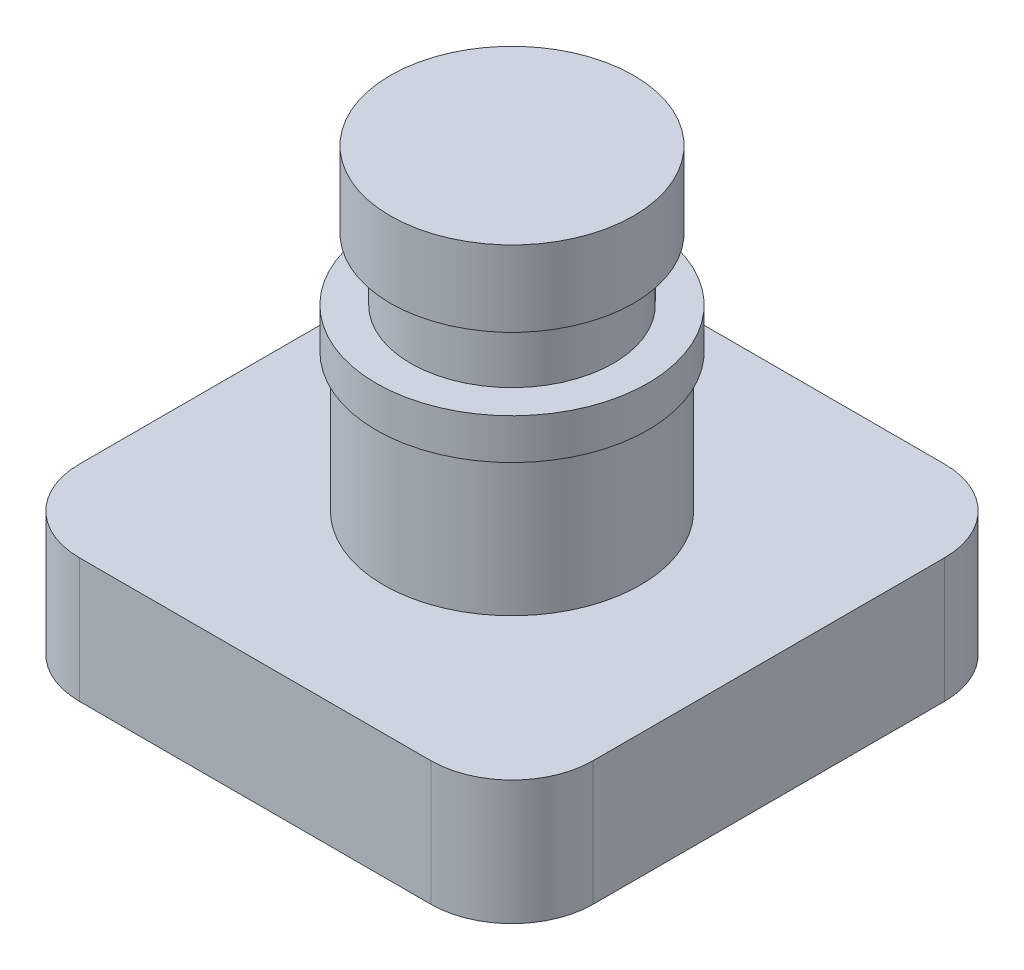
ISO-10303-21;
HEADER;
FILE_DESCRIPTION(('STEP AP214'),'2;1');
FILE_NAME('part.step','',(''),(''),'','','');
FILE_SCHEMA(('AUTOMOTIVE_DESIGN { 1 0 10303 214 1 1 1 1 }'));
ENDSEC;
DATA;
#1=APPLICATION_CONTEXT('core data for automotive mechanical design processes');
#2=APPLICATION_PROTOCOL_DEFINITION('international standard','automotive_design',2000,#1);
#3=PRODUCT_CONTEXT('',#1,'mechanical');
#4=PRODUCT('Part','Part','',(#3));
#5=PRODUCT_RELATED_PRODUCT_CATEGORY('part','',(#4));
#6=PRODUCT_DEFINITION_FORMATION('','',#4);
#7=PRODUCT_DEFINITION_CONTEXT('part definition',#1,'design');
#8=PRODUCT_DEFINITION('design','',#6,#7);
#9=PRODUCT_DEFINITION_SHAPE('','',#8);
#10=(LENGTH_UNIT() NAMED_UNIT(*) SI_UNIT(.MILLI.,.METRE.));
#11=(NAMED_UNIT(*) PLANE_ANGLE_UNIT() SI_UNIT($,.RADIAN.));
#12=(NAMED_UNIT(*) SI_UNIT($,.STERADIAN.) SOLID_ANGLE_UNIT());
#13=UNCERTAINTY_MEASURE_WITH_UNIT(LENGTH_MEASURE(1.E-05),#10,'distance_accuracy_value','');
#14=(GEOMETRIC_REPRESENTATION_CONTEXT(3) GLOBAL_UNCERTAINTY_ASSIGNED_CONTEXT((#13)) GLOBAL_UNIT_ASSIGNED_CONTEXT((#10,
#11,#12)) REPRESENTATION_CONTEXT('',''));
#15=CARTESIAN_POINT('',(0.,0.,0.));
#16=DIRECTION('',(0.,0.,1.));
#17=DIRECTION('',(1.,0.,0.));
#18=AXIS2_PLACEMENT_3D('',#15,#16,#17);
#19=CARTESIAN_POINT('',(6.5,4.6,-6.50000000000001));
#20=DIRECTION('',(0.,-1.,0.));
#21=DIRECTION('',(0.,0.,-1.));
#22=AXIS2_PLACEMENT_3D('',#19,#20,#21);
#23=CYLINDRICAL_SURFACE('',#22,3.);
#24=CARTESIAN_POINT('',(6.5,0.,-6.50000000000001));
#25=DIRECTION('',(0.,1.,0.));
#26=DIRECTION('',(0.,0.,1.));
#27=AXIS2_PLACEMENT_3D('',#24,#25,#26);
#28=CIRCLE('',#27,3.);
#29=CARTESIAN_POINT('',(6.49999999999998,0.,-9.50000000000001));
#30=VERTEX_POINT('',#29);
#31=CARTESIAN_POINT('',(9.5,0.,-6.49999999999998));
#32=VERTEX_POINT('',#31);
#33=EDGE_CURVE('E162',#30,#32,#28,.F.);
#34=ORIENTED_EDGE('',*,*,#33,.F.);
#35=DIRECTION('',(0.,-1.,0.));
#36=VECTOR('',#35,1.);
#37=CARTESIAN_POINT('',(6.49999999999998,4.6,-9.50000000000001));
#38=LINE('',#37,#36);
#39=CARTESIAN_POINT('',(6.49999999999998,4.6,-9.50000000000001));
#40=VERTEX_POINT('',#39);
#41=EDGE_CURVE('E42',#40,#30,#38,.T.);
#42=ORIENTED_EDGE('',*,*,#41,.F.);
#43=CARTESIAN_POINT('',(6.5,4.6,-6.50000000000001));
#44=DIRECTION('',(0.,1.,0.));
#45=DIRECTION('',(0.,0.,1.));
#46=AXIS2_PLACEMENT_3D('',#43,#44,#45);
#47=CIRCLE('',#46,3.);
#48=CARTESIAN_POINT('',(9.5,4.6,-6.49999999999998));
#49=VERTEX_POINT('',#48);
#50=EDGE_CURVE('E206',#40,#49,#47,.F.);
#51=ORIENTED_EDGE('',*,*,#50,.T.);
#52=DIRECTION('',(0.,-1.,0.));
#53=VECTOR('',#52,1.);
#54=CARTESIAN_POINT('',(9.5,4.6,-6.49999999999998));
#55=LINE('',#54,#53);
#56=EDGE_CURVE('E57',#49,#32,#55,.T.);
#57=ORIENTED_EDGE('',*,*,#56,.T.);
#58=EDGE_LOOP('',(#34,#42,#51,#57));
#59=FACE_BOUND('',#58,.T.);
#60=ADVANCED_FACE('F39',(#59),#23,.T.);
#61=CARTESIAN_POINT('',(0.,4.6,-9.50000000000001));
#62=DIRECTION('',(0.,0.,-1.));
#63=DIRECTION('',(-1.,0.,0.));
#64=AXIS2_PLACEMENT_3D('',#61,#62,#63);
#65=PLANE('',#64);
#66=DIRECTION('',(1.,0.,0.));
#67=VECTOR('',#66,1.);
#68=CARTESIAN_POINT('',(0.,0.,-9.50000000000001));
#69=LINE('',#68,#67);
#70=CARTESIAN_POINT('',(-6.49999999999998,0.,-9.50000000000001));
#71=VERTEX_POINT('',#70);
#72=EDGE_CURVE('E159',#71,#30,#69,.T.);
#73=ORIENTED_EDGE('',*,*,#72,.F.);
#74=DIRECTION('',(0.,-1.,0.));
#75=VECTOR('',#74,1.);
#76=CARTESIAN_POINT('',(-6.49999999999998,4.6,-9.50000000000001));
#77=LINE('',#76,#75);
#78=CARTESIAN_POINT('',(-6.49999999999998,4.6,-9.50000000000001));
#79=VERTEX_POINT('',#78);
#80=EDGE_CURVE('E147',#79,#71,#77,.T.);
#81=ORIENTED_EDGE('',*,*,#80,.F.);
#82=DIRECTION('',(1.,0.,0.));
#83=VECTOR('',#82,1.);
#84=CARTESIAN_POINT('',(0.,4.6,-9.50000000000001));
#85=LINE('',#84,#83);
#86=EDGE_CURVE('E161',#79,#40,#85,.T.);
#87=ORIENTED_EDGE('',*,*,#86,.T.);
#88=ORIENTED_EDGE('',*,*,#41,.T.);
#89=EDGE_LOOP('',(#73,#81,#87,#88));
#90=FACE_BOUND('',#89,.T.);
#91=ADVANCED_FACE('F157',(#90),#65,.T.);
#92=CARTESIAN_POINT('',(-6.5,4.6,-6.50000000000001));
#93=DIRECTION('',(0.,-1.,0.));
#94=DIRECTION('',(0.,0.,-1.));
#95=AXIS2_PLACEMENT_3D('',#92,#93,#94);
#96=CYLINDRICAL_SURFACE('',#95,3.);
#97=CARTESIAN_POINT('',(-6.5,0.,-6.50000000000001));
#98=DIRECTION('',(0.,1.,0.));
#99=DIRECTION('',(0.,0.,1.));
#100=AXIS2_PLACEMENT_3D('',#97,#98,#99);
#101=CIRCLE('',#100,3.);
#102=CARTESIAN_POINT('',(-9.5,0.,-6.49999999999998));
#103=VERTEX_POINT('',#102);
#104=EDGE_CURVE('E169',#71,#103,#101,.T.);
#105=ORIENTED_EDGE('',*,*,#104,.T.);
#106=DIRECTION('',(0.,-1.,0.));
#107=VECTOR('',#106,1.);
#108=CARTESIAN_POINT('',(-9.5,4.6,-6.49999999999998));
#109=LINE('',#108,#107);
#110=CARTESIAN_POINT('',(-9.5,4.6,-6.49999999999998));
#111=VERTEX_POINT('',#110);
#112=EDGE_CURVE('E144',#111,#103,#109,.T.);
#113=ORIENTED_EDGE('',*,*,#112,.F.);
#114=CARTESIAN_POINT('',(-6.5,4.6,-6.50000000000001));
#115=DIRECTION('',(0.,1.,0.));
#116=DIRECTION('',(0.,0.,1.));
#117=AXIS2_PLACEMENT_3D('',#114,#115,#116);
#118=CIRCLE('',#117,3.);
#119=EDGE_CURVE('E200',#79,#111,#118,.T.);
#120=ORIENTED_EDGE('',*,*,#119,.F.);
#121=ORIENTED_EDGE('',*,*,#80,.T.);
#122=EDGE_LOOP('',(#105,#113,#120,#121));
#123=FACE_BOUND('',#122,.T.);
#124=ADVANCED_FACE('F257',(#123),#96,.T.);
#125=CARTESIAN_POINT('',(-9.5,4.6,0.));
#126=DIRECTION('',(1.,0.,0.));
#127=DIRECTION('',(0.,0.,-1.));
#128=AXIS2_PLACEMENT_3D('',#125,#126,#127);
#129=PLANE('',#128);
#130=DIRECTION('',(0.,0.,1.));
#131=VECTOR('',#130,1.);
#132=CARTESIAN_POINT('',(-9.5,0.,0.));
#133=LINE('',#132,#131);
#134=CARTESIAN_POINT('',(-9.5,0.,6.49999999999998));
#135=VERTEX_POINT('',#134);
#136=EDGE_CURVE('E173',#103,#135,#133,.T.);
#137=ORIENTED_EDGE('',*,*,#136,.T.);
#138=DIRECTION('',(0.,-1.,0.));
#139=VECTOR('',#138,1.);
#140=CARTESIAN_POINT('',(-9.5,4.6,6.49999999999998));
#141=LINE('',#140,#139);
#142=CARTESIAN_POINT('',(-9.5,4.6,6.49999999999998));
#143=VERTEX_POINT('',#142);
#144=EDGE_CURVE('E136',#143,#135,#141,.T.);
#145=ORIENTED_EDGE('',*,*,#144,.F.);
#146=DIRECTION('',(0.,0.,1.));
#147=VECTOR('',#146,1.);
#148=CARTESIAN_POINT('',(-9.5,4.6,0.));
#149=LINE('',#148,#147);
#150=EDGE_CURVE('E197',#111,#143,#149,.T.);
#151=ORIENTED_EDGE('',*,*,#150,.F.);
#152=ORIENTED_EDGE('',*,*,#112,.T.);
#153=EDGE_LOOP('',(#137,#145,#151,#152));
#154=FACE_BOUND('',#153,.T.);
#155=ADVANCED_FACE('F261',(#154),#129,.F.);
#156=CARTESIAN_POINT('',(-6.5,4.6,6.5));
#157=DIRECTION('',(0.,-1.,0.));
#158=DIRECTION('',(0.,0.,-1.));
#159=AXIS2_PLACEMENT_3D('',#156,#157,#158);
#160=CYLINDRICAL_SURFACE('',#159,3.);
#161=CARTESIAN_POINT('',(-6.5,0.,6.5));
#162=DIRECTION('',(0.,1.,0.));
#163=DIRECTION('',(0.,0.,1.));
#164=AXIS2_PLACEMENT_3D('',#161,#162,#163);
#165=CIRCLE('',#164,3.);
#166=CARTESIAN_POINT('',(-6.49999999999997,0.,9.5));
#167=VERTEX_POINT('',#166);
#168=EDGE_CURVE('E180',#135,#167,#165,.T.);
#169=ORIENTED_EDGE('',*,*,#168,.T.);
#170=DIRECTION('',(0.,-1.,0.));
#171=VECTOR('',#170,1.);
#172=CARTESIAN_POINT('',(-6.49999999999997,4.6,9.5));
#173=LINE('',#172,#171);
#174=CARTESIAN_POINT('',(-6.49999999999997,4.6,9.5));
#175=VERTEX_POINT('',#174);
#176=EDGE_CURVE('E132',#175,#167,#173,.T.);
#177=ORIENTED_EDGE('',*,*,#176,.F.);
#178=CARTESIAN_POINT('',(-6.5,4.6,6.5));
#179=DIRECTION('',(0.,1.,0.));
#180=DIRECTION('',(0.,0.,1.));
#181=AXIS2_PLACEMENT_3D('',#178,#179,#180);
#182=CIRCLE('',#181,3.);
#183=EDGE_CURVE('E123',#143,#175,#182,.T.);
#184=ORIENTED_EDGE('',*,*,#183,.F.);
#185=ORIENTED_EDGE('',*,*,#144,.T.);
#186=EDGE_LOOP('',(#169,#177,#184,#185));
#187=FACE_BOUND('',#186,.T.);
#188=ADVANCED_FACE('F266',(#187),#160,.T.);
#189=CARTESIAN_POINT('',(0.,4.6,9.5));
#190=DIRECTION('',(0.,0.,-1.));
#191=DIRECTION('',(-1.,0.,0.));
#192=AXIS2_PLACEMENT_3D('',#189,#190,#191);
#193=PLANE('',#192);
#194=DIRECTION('',(1.,0.,0.));
#195=VECTOR('',#194,1.);
#196=CARTESIAN_POINT('',(0.,0.,9.5));
#197=LINE('',#196,#195);
#198=CARTESIAN_POINT('',(6.49999999999998,0.,9.5));
#199=VERTEX_POINT('',#198);
#200=EDGE_CURVE('E130',#167,#199,#197,.T.);
#201=ORIENTED_EDGE('',*,*,#200,.T.);
#202=DIRECTION('',(0.,-1.,0.));
#203=VECTOR('',#202,1.);
#204=CARTESIAN_POINT('',(6.49999999999998,4.6,9.5));
#205=LINE('',#204,#203);
#206=CARTESIAN_POINT('',(6.49999999999998,4.6,9.5));
#207=VERTEX_POINT('',#206);
#208=EDGE_CURVE('E112',#207,#199,#205,.T.);
#209=ORIENTED_EDGE('',*,*,#208,.F.);
#210=DIRECTION('',(1.,0.,0.));
#211=VECTOR('',#210,1.);
#212=CARTESIAN_POINT('',(0.,4.6,9.5));
#213=LINE('',#212,#211);
#214=EDGE_CURVE('E118',#175,#207,#213,.T.);
#215=ORIENTED_EDGE('',*,*,#214,.F.);
#216=ORIENTED_EDGE('',*,*,#176,.T.);
#217=EDGE_LOOP('',(#201,#209,#215,#216));
#218=FACE_BOUND('',#217,.T.);
#219=ADVANCED_FACE('F129',(#218),#193,.F.);
#220=CARTESIAN_POINT('',(6.5,4.6,6.5));
#221=DIRECTION('',(0.,-1.,0.));
#222=DIRECTION('',(0.,0.,-1.));
#223=AXIS2_PLACEMENT_3D('',#220,#221,#222);
#224=CYLINDRICAL_SURFACE('',#223,3.);
#225=CARTESIAN_POINT('',(6.5,0.,6.5));
#226=DIRECTION('',(0.,1.,0.));
#227=DIRECTION('',(0.,0.,1.));
#228=AXIS2_PLACEMENT_3D('',#225,#226,#227);
#229=CIRCLE('',#228,3.);
#230=CARTESIAN_POINT('',(9.5,0.,6.49999999999998));
#231=VERTEX_POINT('',#230);
#232=EDGE_CURVE('E186',#199,#231,#229,.T.);
#233=ORIENTED_EDGE('',*,*,#232,.T.);
#234=DIRECTION('',(0.,-1.,0.));
#235=VECTOR('',#234,1.);
#236=CARTESIAN_POINT('',(9.5,4.6,6.49999999999998));
#237=LINE('',#236,#235);
#238=CARTESIAN_POINT('',(9.5,4.6,6.49999999999998));
#239=VERTEX_POINT('',#238);
#240=EDGE_CURVE('E84',#239,#231,#237,.T.);
#241=ORIENTED_EDGE('',*,*,#240,.F.);
#242=CARTESIAN_POINT('',(6.5,4.6,6.5));
#243=DIRECTION('',(0.,1.,0.));
#244=DIRECTION('',(0.,0.,1.));
#245=AXIS2_PLACEMENT_3D('',#242,#243,#244);
#246=CIRCLE('',#245,3.);
#247=EDGE_CURVE('E108',#207,#239,#246,.T.);
#248=ORIENTED_EDGE('',*,*,#247,.F.);
#249=ORIENTED_EDGE('',*,*,#208,.T.);
#250=EDGE_LOOP('',(#233,#241,#248,#249));
#251=FACE_BOUND('',#250,.T.);
#252=ADVANCED_FACE('F110',(#251),#224,.T.);
#253=CARTESIAN_POINT('',(9.5,4.6,0.));
#254=DIRECTION('',(1.,0.,0.));
#255=DIRECTION('',(0.,0.,-1.));
#256=AXIS2_PLACEMENT_3D('',#253,#254,#255);
#257=PLANE('',#256);
#258=DIRECTION('',(0.,0.,1.));
#259=VECTOR('',#258,1.);
#260=CARTESIAN_POINT('',(9.5,0.,0.));
#261=LINE('',#260,#259);
#262=EDGE_CURVE('E189',#32,#231,#261,.T.);
#263=ORIENTED_EDGE('',*,*,#262,.F.);
#264=ORIENTED_EDGE('',*,*,#56,.F.);
#265=DIRECTION('',(0.,0.,1.));
#266=VECTOR('',#265,1.);
#267=CARTESIAN_POINT('',(9.5,4.6,0.));
#268=LINE('',#267,#266);
#269=EDGE_CURVE('E117',#49,#239,#268,.T.);
#270=ORIENTED_EDGE('',*,*,#269,.T.);
#271=ORIENTED_EDGE('',*,*,#240,.T.);
#272=EDGE_LOOP('',(#263,#264,#270,#271));
#273=FACE_BOUND('',#272,.T.);
#274=ADVANCED_FACE('F275',(#273),#257,.T.);
#275=CARTESIAN_POINT('',(0.,4.6,0.));
#276=DIRECTION('',(0.,1.,0.));
#277=DIRECTION('',(0.,0.,1.));
#278=AXIS2_PLACEMENT_3D('',#275,#276,#277);
#279=PLANE('',#278);
#280=CARTESIAN_POINT('',(0.,4.6,0.));
#281=DIRECTION('',(0.,1.,0.));
#282=DIRECTION('',(0.,0.,1.));
#283=AXIS2_PLACEMENT_3D('',#280,#281,#282);
#284=CIRCLE('',#283,4.75);
#285=CARTESIAN_POINT('',(0.,4.6,4.75));
#286=VERTEX_POINT('',#285);
#287=EDGE_CURVE('E191',#286,#286,#284,.T.);
#288=ORIENTED_EDGE('',*,*,#287,.F.);
#289=EDGE_LOOP('',(#288));
#290=FACE_BOUND('',#289,.T.);
#291=ORIENTED_EDGE('',*,*,#50,.F.);
#292=ORIENTED_EDGE('',*,*,#86,.F.);
#293=ORIENTED_EDGE('',*,*,#119,.T.);
#294=ORIENTED_EDGE('',*,*,#150,.T.);
#295=ORIENTED_EDGE('',*,*,#183,.T.);
#296=ORIENTED_EDGE('',*,*,#214,.T.);
#297=ORIENTED_EDGE('',*,*,#247,.T.);
#298=ORIENTED_EDGE('',*,*,#269,.F.);
#299=EDGE_LOOP('',(#291,#292,#293,#294,#295,#296,#297,#298));
#300=FACE_BOUND('',#299,.T.);
#301=ADVANCED_FACE('F121',(#290,#300),#279,.T.);
#302=CARTESIAN_POINT('',(0.,0.,0.));
#303=DIRECTION('',(0.,1.,0.));
#304=DIRECTION('',(0.,0.,1.));
#305=AXIS2_PLACEMENT_3D('',#302,#303,#304);
#306=PLANE('',#305);
#307=ORIENTED_EDGE('',*,*,#33,.T.);
#308=ORIENTED_EDGE('',*,*,#262,.T.);
#309=ORIENTED_EDGE('',*,*,#232,.F.);
#310=ORIENTED_EDGE('',*,*,#200,.F.);
#311=ORIENTED_EDGE('',*,*,#168,.F.);
#312=ORIENTED_EDGE('',*,*,#136,.F.);
#313=ORIENTED_EDGE('',*,*,#104,.F.);
#314=ORIENTED_EDGE('',*,*,#72,.T.);
#315=EDGE_LOOP('',(#307,#308,#309,#310,#311,#312,#313,#314));
#316=FACE_BOUND('',#315,.T.);
#317=ADVANCED_FACE('F168',(#316),#306,.F.);
#318=CARTESIAN_POINT('',(0.,-13.4350288425444,0.));
#319=DIRECTION('',(0.,1.,0.));
#320=DIRECTION('',(0.,0.,1.));
#321=AXIS2_PLACEMENT_3D('',#318,#319,#320);
#322=CYLINDRICAL_SURFACE('',#321,4.75);
#323=ORIENTED_EDGE('',*,*,#287,.T.);
#324=EDGE_LOOP('',(#323));
#325=FACE_BOUND('',#324,.T.);
#326=CARTESIAN_POINT('',(0.,9.7,0.));
#327=DIRECTION('',(0.,1.,0.));
#328=DIRECTION('',(0.,0.,1.));
#329=AXIS2_PLACEMENT_3D('',#326,#327,#328);
#330=CIRCLE('',#329,4.75);
#331=CARTESIAN_POINT('',(0.,9.7,4.75));
#332=VERTEX_POINT('',#331);
#333=EDGE_CURVE('E166',#332,#332,#330,.T.);
#334=ORIENTED_EDGE('',*,*,#333,.F.);
#335=EDGE_LOOP('',(#334));
#336=FACE_BOUND('',#335,.T.);
#337=ADVANCED_FACE('F280',(#325,#336),#322,.T.);
#338=CARTESIAN_POINT('',(0.,11.2,0.));
#339=DIRECTION('',(0.,-1.,0.));
#340=DIRECTION('',(0.,0.,-1.));
#341=AXIS2_PLACEMENT_3D('',#338,#339,#340);
#342=CYLINDRICAL_SURFACE('',#341,5.025);
#343=CARTESIAN_POINT('',(0.,11.2,0.));
#344=DIRECTION('',(0.,1.,0.));
#345=DIRECTION('',(0.,0.,1.));
#346=AXIS2_PLACEMENT_3D('',#343,#344,#345);
#347=CIRCLE('',#346,5.025);
#348=CARTESIAN_POINT('',(0.,11.2,5.02499999999992));
#349=VERTEX_POINT('',#348);
#350=EDGE_CURVE('E215',#349,#349,#347,.T.);
#351=ORIENTED_EDGE('',*,*,#350,.F.);
#352=EDGE_LOOP('',(#351));
#353=FACE_BOUND('',#352,.T.);
#354=CARTESIAN_POINT('',(0.,9.7,0.));
#355=DIRECTION('',(0.,1.,0.));
#356=DIRECTION('',(0.,0.,1.));
#357=AXIS2_PLACEMENT_3D('',#354,#355,#356);
#358=CIRCLE('',#357,5.025);
#359=CARTESIAN_POINT('',(0.,9.70000000000003,5.02499999999993));
#360=VERTEX_POINT('',#359);
#361=EDGE_CURVE('E216',#360,#360,#358,.T.);
#362=ORIENTED_EDGE('',*,*,#361,.T.);
#363=EDGE_LOOP('',(#362));
#364=FACE_BOUND('',#363,.T.);
#365=ADVANCED_FACE('F286',(#353,#364),#342,.T.);
#366=CARTESIAN_POINT('',(0.,11.2,0.));
#367=DIRECTION('',(0.,1.,0.));
#368=DIRECTION('',(0.,0.,1.));
#369=AXIS2_PLACEMENT_3D('',#366,#367,#368);
#370=PLANE('',#369);
#371=CARTESIAN_POINT('',(0.,11.2,0.));
#372=DIRECTION('',(0.,1.,0.));
#373=DIRECTION('',(0.,0.,1.));
#374=AXIS2_PLACEMENT_3D('',#371,#372,#373);
#375=CIRCLE('',#374,3.75);
#376=CARTESIAN_POINT('',(0.,11.2,3.74999999999992));
#377=VERTEX_POINT('',#376);
#378=EDGE_CURVE('E11',#377,#377,#375,.T.);
#379=ORIENTED_EDGE('',*,*,#378,.F.);
#380=EDGE_LOOP('',(#379));
#381=FACE_BOUND('',#380,.T.);
#382=ORIENTED_EDGE('',*,*,#350,.T.);
#383=EDGE_LOOP('',(#382));
#384=FACE_BOUND('',#383,.T.);
#385=ADVANCED_FACE('F290',(#381,#384),#370,.T.);
#386=CARTESIAN_POINT('',(0.,9.7,0.));
#387=DIRECTION('',(0.,1.,0.));
#388=DIRECTION('',(0.,0.,1.));
#389=AXIS2_PLACEMENT_3D('',#386,#387,#388);
#390=PLANE('',#389);
#391=ORIENTED_EDGE('',*,*,#333,.T.);
#392=EDGE_LOOP('',(#391));
#393=FACE_BOUND('',#392,.T.);
#394=ORIENTED_EDGE('',*,*,#361,.F.);
#395=EDGE_LOOP('',(#394));
#396=FACE_BOUND('',#395,.T.);
#397=ADVANCED_FACE('F292',(#393,#396),#390,.F.);
#398=CARTESIAN_POINT('',(0.,13.5,0.));
#399=DIRECTION('',(0.,-1.,0.));
#400=DIRECTION('',(0.,0.,-1.));
#401=AXIS2_PLACEMENT_3D('',#398,#399,#400);
#402=CYLINDRICAL_SURFACE('',#401,3.75);
#403=CARTESIAN_POINT('',(0.,13.5,0.));
#404=DIRECTION('',(0.,1.,0.));
#405=DIRECTION('',(0.,0.,1.));
#406=AXIS2_PLACEMENT_3D('',#403,#404,#405);
#407=CIRCLE('',#406,3.75);
#408=CARTESIAN_POINT('',(0.,13.5,3.74999999999991));
#409=VERTEX_POINT('',#408);
#410=EDGE_CURVE('E220',#409,#409,#407,.T.);
#411=ORIENTED_EDGE('',*,*,#410,.F.);
#412=EDGE_LOOP('',(#411));
#413=FACE_BOUND('',#412,.T.);
#414=ORIENTED_EDGE('',*,*,#378,.T.);
#415=EDGE_LOOP('',(#414));
#416=FACE_BOUND('',#415,.T.);
#417=ADVANCED_FACE('F241',(#413,#416),#402,.T.);
#418=CARTESIAN_POINT('',(0.,16.3,-2.27644583292572E-13));
#419=DIRECTION('',(0.,-1.,0.));
#420=DIRECTION('',(0.,0.,-1.));
#421=AXIS2_PLACEMENT_3D('',#418,#419,#420);
#422=CYLINDRICAL_SURFACE('',#421,4.5);
#423=CARTESIAN_POINT('',(0.,16.3,-2.27644583292572E-13));
#424=DIRECTION('',(0.,1.,0.));
#425=DIRECTION('',(0.,0.,1.));
#426=AXIS2_PLACEMENT_3D('',#423,#424,#425);
#427=CIRCLE('',#426,4.5);
#428=CARTESIAN_POINT('',(0.,16.3000000000001,4.49999999999977));
#429=VERTEX_POINT('',#428);
#430=EDGE_CURVE('E227',#429,#429,#427,.T.);
#431=ORIENTED_EDGE('',*,*,#430,.F.);
#432=EDGE_LOOP('',(#431));
#433=FACE_BOUND('',#432,.T.);
#434=CARTESIAN_POINT('',(0.,13.5,-1.88539992297529E-13));
#435=DIRECTION('',(0.,1.,0.));
#436=DIRECTION('',(0.,0.,1.));
#437=AXIS2_PLACEMENT_3D('',#434,#435,#436);
#438=CIRCLE('',#437,4.5);
#439=CARTESIAN_POINT('',(0.,13.5000000000001,4.49999999999981));
#440=VERTEX_POINT('',#439);
#441=EDGE_CURVE('E228',#440,#440,#438,.T.);
#442=ORIENTED_EDGE('',*,*,#441,.T.);
#443=EDGE_LOOP('',(#442));
#444=FACE_BOUND('',#443,.T.);
#445=ADVANCED_FACE('F238',(#433,#444),#422,.T.);
#446=CARTESIAN_POINT('',(0.,16.3,-2.27644583292572E-13));
#447=DIRECTION('',(0.,1.,0.));
#448=DIRECTION('',(0.,0.,1.));
#449=AXIS2_PLACEMENT_3D('',#446,#447,#448);
#450=PLANE('',#449);
#451=ORIENTED_EDGE('',*,*,#430,.T.);
#452=EDGE_LOOP('',(#451));
#453=FACE_BOUND('',#452,.T.);
#454=ADVANCED_FACE('F236',(#453),#450,.T.);
#455=CARTESIAN_POINT('',(0.,13.5,-1.88539992297529E-13));
#456=DIRECTION('',(0.,1.,0.));
#457=DIRECTION('',(0.,0.,1.));
#458=AXIS2_PLACEMENT_3D('',#455,#456,#457);
#459=PLANE('',#458);
#460=ORIENTED_EDGE('',*,*,#410,.T.);
#461=EDGE_LOOP('',(#460));
#462=FACE_BOUND('',#461,.T.);
#463=ORIENTED_EDGE('',*,*,#441,.F.);
#464=EDGE_LOOP('',(#463));
#465=FACE_BOUND('',#464,.T.);
#466=ADVANCED_FACE('F245',(#462,#465),#459,.F.);
#467=CLOSED_SHELL('',(#60,#91,#124,#155,#188,#219,#252,#274,#301,#317,#337,#365,#385,#397,#417,
#445,#454,#466));
#468=MANIFOLD_SOLID_BREP('B2',#467);
#469=ADVANCED_BREP_SHAPE_REPRESENTATION('',(#18,#468),#14);
#470=SHAPE_DEFINITION_REPRESENTATION(#9,#469);
ENDSEC;
END-ISO-10303-21;
